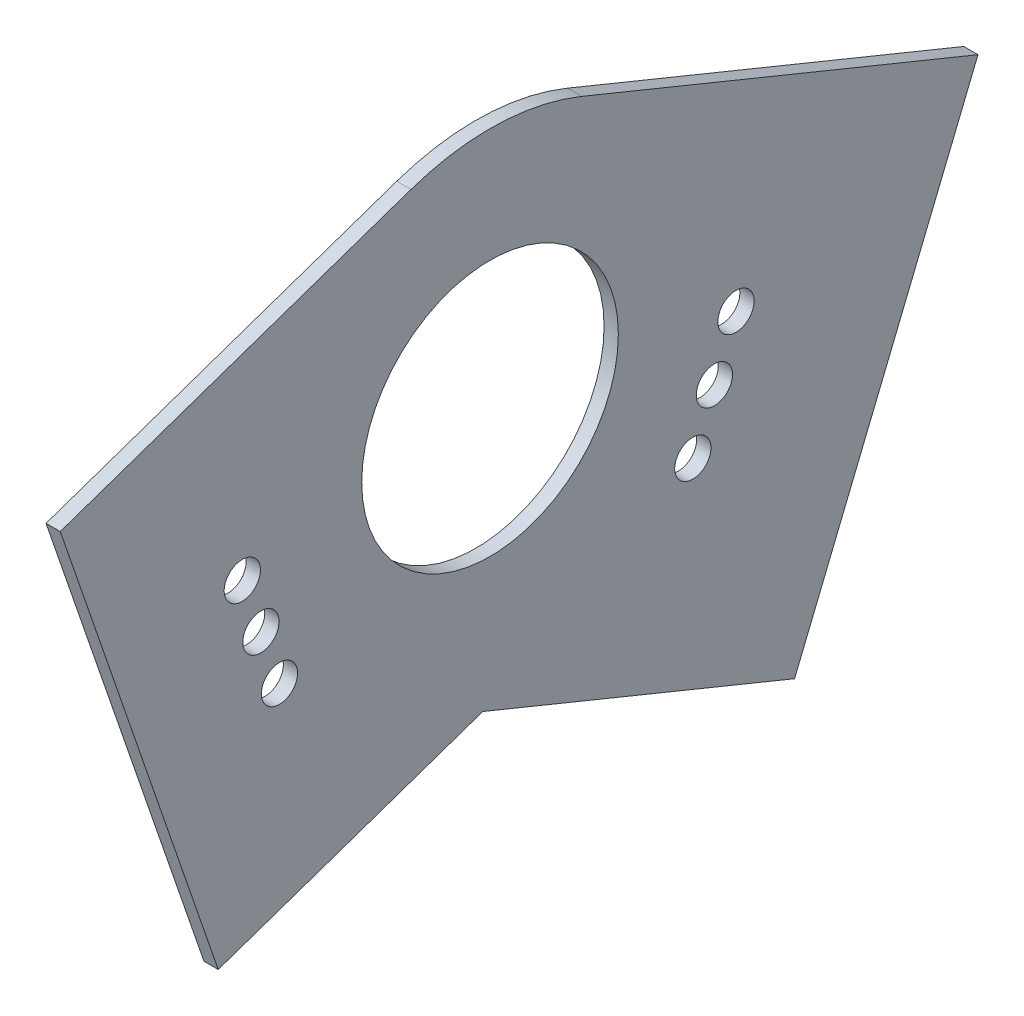
ISO-10303-21;
HEADER;
FILE_DESCRIPTION(('STEP AP214'),'2;1');
FILE_NAME('part.step','',(''),(''),'','','');
FILE_SCHEMA(('AUTOMOTIVE_DESIGN { 1 0 10303 214 1 1 1 1 }'));
ENDSEC;
DATA;
#1=APPLICATION_CONTEXT('core data for automotive mechanical design processes');
#2=APPLICATION_PROTOCOL_DEFINITION('international standard','automotive_design',2000,#1);
#3=PRODUCT_CONTEXT('',#1,'mechanical');
#4=PRODUCT('Part','Part','',(#3));
#5=PRODUCT_RELATED_PRODUCT_CATEGORY('part','',(#4));
#6=PRODUCT_DEFINITION_FORMATION('','',#4);
#7=PRODUCT_DEFINITION_CONTEXT('part definition',#1,'design');
#8=PRODUCT_DEFINITION('design','',#6,#7);
#9=PRODUCT_DEFINITION_SHAPE('','',#8);
#10=(LENGTH_UNIT() NAMED_UNIT(*) SI_UNIT(.MILLI.,.METRE.));
#11=(NAMED_UNIT(*) PLANE_ANGLE_UNIT() SI_UNIT($,.RADIAN.));
#12=(NAMED_UNIT(*) SI_UNIT($,.STERADIAN.) SOLID_ANGLE_UNIT());
#13=UNCERTAINTY_MEASURE_WITH_UNIT(LENGTH_MEASURE(1.E-05),#10,'distance_accuracy_value','');
#14=(GEOMETRIC_REPRESENTATION_CONTEXT(3) GLOBAL_UNCERTAINTY_ASSIGNED_CONTEXT((#13)) GLOBAL_UNIT_ASSIGNED_CONTEXT((#10,
#11,#12)) REPRESENTATION_CONTEXT('',''));
#15=CARTESIAN_POINT('',(0.,0.,0.));
#16=DIRECTION('',(0.,0.,1.));
#17=DIRECTION('',(1.,0.,0.));
#18=AXIS2_PLACEMENT_3D('',#15,#16,#17);
#19=CARTESIAN_POINT('',(0.,146.920050900126,-249.345231223034));
#20=DIRECTION('',(0.,-0.32589472207946,0.945406066259759));
#21=DIRECTION('',(0.,-0.945406066259759,-0.32589472207946));
#22=AXIS2_PLACEMENT_3D('',#19,#20,#21);
#23=PLANE('',#22);
#24=DIRECTION('',(1.,0.,0.));
#25=VECTOR('',#24,1.);
#26=CARTESIAN_POINT('',(0.,146.920050900126,-249.345231223034));
#27=LINE('',#26,#25);
#28=CARTESIAN_POINT('',(-1.5875,146.920050900126,-249.345231223034));
#29=VERTEX_POINT('',#28);
#30=CARTESIAN_POINT('',(0.,146.920050900126,-249.345231223034));
#31=VERTEX_POINT('',#30);
#32=EDGE_CURVE('E11',#29,#31,#27,.T.);
#33=ORIENTED_EDGE('',*,*,#32,.F.);
#34=DIRECTION('',(0.,-0.945406066259759,-0.32589472207946));
#35=VECTOR('',#34,1.);
#36=CARTESIAN_POINT('',(-1.5875,146.920050900126,-249.345231223034));
#37=LINE('',#36,#35);
#38=CARTESIAN_POINT('',(-1.5875,95.8917584737553,-266.935398847272));
#39=VERTEX_POINT('',#38);
#40=EDGE_CURVE('E100',#29,#39,#37,.T.);
#41=ORIENTED_EDGE('',*,*,#40,.T.);
#42=DIRECTION('',(1.,0.,0.));
#43=VECTOR('',#42,1.);
#44=CARTESIAN_POINT('',(0.,95.8917584737553,-266.935398847272));
#45=LINE('',#44,#43);
#46=CARTESIAN_POINT('',(0.,95.8917584737553,-266.935398847272));
#47=VERTEX_POINT('',#46);
#48=EDGE_CURVE('E46',#39,#47,#45,.T.);
#49=ORIENTED_EDGE('',*,*,#48,.T.);
#50=DIRECTION('',(0.,-0.945406066259759,-0.32589472207946));
#51=VECTOR('',#50,1.);
#52=CARTESIAN_POINT('',(0.,146.920050900126,-249.345231223034));
#53=LINE('',#52,#51);
#54=EDGE_CURVE('E136',#31,#47,#53,.T.);
#55=ORIENTED_EDGE('',*,*,#54,.F.);
#56=EDGE_LOOP('',(#33,#41,#49,#55));
#57=FACE_BOUND('',#56,.T.);
#58=ADVANCED_FACE('F36',(#57),#23,.T.);
#59=CARTESIAN_POINT('',(0.,95.8917584737553,-266.935398847272));
#60=DIRECTION('',(0.,-0.945406066259759,-0.32589472207946));
#61=DIRECTION('',(0.,0.32589472207946,-0.945406066259759));
#62=AXIS2_PLACEMENT_3D('',#59,#60,#61);
#63=PLANE('',#62);
#64=ORIENTED_EDGE('',*,*,#48,.F.);
#65=DIRECTION('',(0.,0.32589472207946,-0.945406066259759));
#66=VECTOR('',#65,1.);
#67=CARTESIAN_POINT('',(-1.5875,95.8917584737553,-266.935398847272));
#68=LINE('',#67,#66);
#69=CARTESIAN_POINT('',(-1.5875,106.044156633204,-296.387053497535));
#70=VERTEX_POINT('',#69);
#71=EDGE_CURVE('E119',#39,#70,#68,.T.);
#72=ORIENTED_EDGE('',*,*,#71,.T.);
#73=DIRECTION('',(1.,0.,0.));
#74=VECTOR('',#73,1.);
#75=CARTESIAN_POINT('',(0.,106.044156633204,-296.387053497535));
#76=LINE('',#75,#74);
#77=CARTESIAN_POINT('',(0.,106.044156633204,-296.387053497535));
#78=VERTEX_POINT('',#77);
#79=EDGE_CURVE('E129',#70,#78,#76,.T.);
#80=ORIENTED_EDGE('',*,*,#79,.T.);
#81=DIRECTION('',(0.,0.32589472207946,-0.945406066259759));
#82=VECTOR('',#81,1.);
#83=CARTESIAN_POINT('',(0.,95.8917584737553,-266.935398847272));
#84=LINE('',#83,#82);
#85=EDGE_CURVE('E145',#47,#78,#84,.T.);
#86=ORIENTED_EDGE('',*,*,#85,.F.);
#87=EDGE_LOOP('',(#64,#72,#80,#86));
#88=FACE_BOUND('',#87,.T.);
#89=ADVANCED_FACE('F148',(#88),#63,.T.);
#90=CARTESIAN_POINT('',(0.,106.044156633204,-296.387053497535));
#91=DIRECTION('',(0.,-0.925620560152266,0.378452875036518));
#92=DIRECTION('',(0.,-0.378452875036518,-0.925620560152266));
#93=AXIS2_PLACEMENT_3D('',#90,#91,#92);
#94=PLANE('',#93);
#95=ORIENTED_EDGE('',*,*,#79,.F.);
#96=DIRECTION('',(0.,-0.378452875036518,-0.925620560152266));
#97=VECTOR('',#96,1.);
#98=CARTESIAN_POINT('',(-1.5875,106.044156633204,-296.387053497535));
#99=LINE('',#98,#97);
#100=CARTESIAN_POINT('',(-1.5875,91.8512708518325,-331.1000329824));
#101=VERTEX_POINT('',#100);
#102=EDGE_CURVE('E116',#70,#101,#99,.T.);
#103=ORIENTED_EDGE('',*,*,#102,.T.);
#104=DIRECTION('',(1.,0.,0.));
#105=VECTOR('',#104,1.);
#106=CARTESIAN_POINT('',(0.,91.8512708518325,-331.1000329824));
#107=LINE('',#106,#105);
#108=CARTESIAN_POINT('',(0.,91.8512708518325,-331.1000329824));
#109=VERTEX_POINT('',#108);
#110=EDGE_CURVE('E126',#101,#109,#107,.T.);
#111=ORIENTED_EDGE('',*,*,#110,.T.);
#112=DIRECTION('',(0.,-0.378452875036518,-0.925620560152266));
#113=VECTOR('',#112,1.);
#114=CARTESIAN_POINT('',(0.,106.044156633204,-296.387053497535));
#115=LINE('',#114,#113);
#116=EDGE_CURVE('E149',#78,#109,#115,.T.);
#117=ORIENTED_EDGE('',*,*,#116,.F.);
#118=EDGE_LOOP('',(#95,#103,#111,#117));
#119=FACE_BOUND('',#118,.T.);
#120=ADVANCED_FACE('F198',(#119),#94,.T.);
#121=CARTESIAN_POINT('',(0.,91.8512708518325,-331.1000329824));
#122=DIRECTION('',(0.,-0.378452875036517,-0.925620560152266));
#123=DIRECTION('',(0.,0.925620560152266,-0.378452875036517));
#124=AXIS2_PLACEMENT_3D('',#121,#122,#123);
#125=PLANE('',#124);
#126=ORIENTED_EDGE('',*,*,#110,.F.);
#127=DIRECTION('',(0.,0.925620560152266,-0.378452875036517));
#128=VECTOR('',#127,1.);
#129=CARTESIAN_POINT('',(-1.5875,91.8512708518325,-331.1000329824));
#130=LINE('',#129,#128);
#131=CARTESIAN_POINT('',(-1.5875,141.811640586051,-351.527026912496));
#132=VERTEX_POINT('',#131);
#133=EDGE_CURVE('E113',#101,#132,#130,.T.);
#134=ORIENTED_EDGE('',*,*,#133,.T.);
#135=DIRECTION('',(1.,0.,0.));
#136=VECTOR('',#135,1.);
#137=CARTESIAN_POINT('',(0.,141.811640586051,-351.527026912496));
#138=LINE('',#137,#136);
#139=CARTESIAN_POINT('',(0.,141.811640586051,-351.527026912496));
#140=VERTEX_POINT('',#139);
#141=EDGE_CURVE('E124',#132,#140,#138,.T.);
#142=ORIENTED_EDGE('',*,*,#141,.T.);
#143=DIRECTION('',(0.,0.925620560152266,-0.378452875036517));
#144=VECTOR('',#143,1.);
#145=CARTESIAN_POINT('',(0.,91.8512708518325,-331.1000329824));
#146=LINE('',#145,#144);
#147=EDGE_CURVE('E151',#109,#140,#146,.T.);
#148=ORIENTED_EDGE('',*,*,#147,.F.);
#149=EDGE_LOOP('',(#126,#134,#142,#148));
#150=FACE_BOUND('',#149,.T.);
#151=ADVANCED_FACE('F203',(#150),#125,.T.);
#152=CARTESIAN_POINT('',(0.,141.811640586051,-351.527026912496));
#153=DIRECTION('',(0.,0.925620560152265,-0.378452875036518));
#154=DIRECTION('',(0.,0.378452875036518,0.925620560152265));
#155=AXIS2_PLACEMENT_3D('',#152,#153,#154);
#156=PLANE('',#155);
#157=ORIENTED_EDGE('',*,*,#141,.F.);
#158=DIRECTION('',(0.,0.378452875036518,0.925620560152265));
#159=VECTOR('',#158,1.);
#160=CARTESIAN_POINT('',(-1.5875,141.811640586051,-351.527026912496));
#161=LINE('',#160,#159);
#162=CARTESIAN_POINT('',(-1.5875,159.849395245253,-307.410261859704));
#163=VERTEX_POINT('',#162);
#164=EDGE_CURVE('E110',#132,#163,#161,.T.);
#165=ORIENTED_EDGE('',*,*,#164,.T.);
#166=DIRECTION('',(1.,0.,0.));
#167=VECTOR('',#166,1.);
#168=CARTESIAN_POINT('',(0.,159.849395245253,-307.410261859704));
#169=LINE('',#168,#167);
#170=CARTESIAN_POINT('',(0.,159.849395245253,-307.410261859704));
#171=VERTEX_POINT('',#170);
#172=EDGE_CURVE('E54',#163,#171,#169,.T.);
#173=ORIENTED_EDGE('',*,*,#172,.T.);
#174=DIRECTION('',(0.,0.378452875036518,0.925620560152265));
#175=VECTOR('',#174,1.);
#176=CARTESIAN_POINT('',(0.,141.811640586051,-351.527026912496));
#177=LINE('',#176,#175);
#178=EDGE_CURVE('E93',#140,#171,#177,.T.);
#179=ORIENTED_EDGE('',*,*,#178,.F.);
#180=EDGE_LOOP('',(#157,#165,#173,#179));
#181=FACE_BOUND('',#180,.T.);
#182=ADVANCED_FACE('F207',(#181),#156,.T.);
#183=CARTESIAN_POINT('',(0.,134.869210378144,-297.196764894656));
#184=DIRECTION('',(1.,0.,0.));
#185=DIRECTION('',(0.,0.,-1.));
#186=AXIS2_PLACEMENT_3D('',#183,#184,#185);
#187=CYLINDRICAL_SURFACE('',#186,26.9875);
#188=ORIENTED_EDGE('',*,*,#172,.F.);
#189=CARTESIAN_POINT('',(-1.5875,134.869210378144,-297.196764894656));
#190=DIRECTION('',(1.,0.,0.));
#191=DIRECTION('',(0.,0.,-1.));
#192=AXIS2_PLACEMENT_3D('',#189,#190,#191);
#193=CIRCLE('',#192,26.9875);
#194=CARTESIAN_POINT('',(-1.5875,160.383356591329,-288.401681082536));
#195=VERTEX_POINT('',#194);
#196=EDGE_CURVE('E98',#163,#195,#193,.T.);
#197=ORIENTED_EDGE('',*,*,#196,.T.);
#198=DIRECTION('',(1.,0.,0.));
#199=VECTOR('',#198,1.);
#200=CARTESIAN_POINT('',(0.,160.383356591329,-288.401681082536));
#201=LINE('',#200,#199);
#202=CARTESIAN_POINT('',(0.,160.383356591329,-288.401681082536));
#203=VERTEX_POINT('',#202);
#204=EDGE_CURVE('E40',#195,#203,#201,.T.);
#205=ORIENTED_EDGE('',*,*,#204,.T.);
#206=CARTESIAN_POINT('',(0.,134.869210378144,-297.196764894656));
#207=DIRECTION('',(1.,0.,0.));
#208=DIRECTION('',(0.,0.,-1.));
#209=AXIS2_PLACEMENT_3D('',#206,#207,#208);
#210=CIRCLE('',#209,26.9875);
#211=EDGE_CURVE('E283',#171,#203,#210,.T.);
#212=ORIENTED_EDGE('',*,*,#211,.F.);
#213=EDGE_LOOP('',(#188,#197,#205,#212));
#214=FACE_BOUND('',#213,.T.);
#215=ADVANCED_FACE('F102',(#214),#187,.T.);
#216=CARTESIAN_POINT('',(0.,118.778022856129,-319.773774005283));
#217=DIRECTION('',(1.,0.,0.));
#218=DIRECTION('',(0.,0.,-1.));
#219=AXIS2_PLACEMENT_3D('',#216,#217,#218);
#220=CYLINDRICAL_SURFACE('',#219,2.01929999999998);
#221=CARTESIAN_POINT('',(0.,118.778022856129,-319.773774005283));
#222=DIRECTION('',(1.,0.,0.));
#223=DIRECTION('',(0.,0.,-1.));
#224=AXIS2_PLACEMENT_3D('',#221,#222,#223);
#225=CIRCLE('',#224,2.01929999999998);
#226=CARTESIAN_POINT('',(0.,118.778022856129,-321.793074005283));
#227=VERTEX_POINT('',#226);
#228=EDGE_CURVE('E112',#227,#227,#225,.T.);
#229=ORIENTED_EDGE('',*,*,#228,.T.);
#230=EDGE_LOOP('',(#229));
#231=FACE_BOUND('',#230,.T.);
#232=CARTESIAN_POINT('',(-1.5875,118.778022856129,-319.773774005283));
#233=DIRECTION('',(1.,0.,0.));
#234=DIRECTION('',(0.,0.,-1.));
#235=AXIS2_PLACEMENT_3D('',#232,#233,#234);
#236=CIRCLE('',#235,2.01929999999998);
#237=CARTESIAN_POINT('',(-1.5875,118.778022856129,-321.793074005283));
#238=VERTEX_POINT('',#237);
#239=EDGE_CURVE('E159',#238,#238,#236,.T.);
#240=ORIENTED_EDGE('',*,*,#239,.F.);
#241=EDGE_LOOP('',(#240));
#242=FACE_BOUND('',#241,.T.);
#243=ADVANCED_FACE('F212',(#231,#242),#220,.F.);
#244=CARTESIAN_POINT('',(0.,124.655713413096,-322.176949761765));
#245=DIRECTION('',(1.,0.,0.));
#246=DIRECTION('',(0.,0.,-1.));
#247=AXIS2_PLACEMENT_3D('',#244,#245,#246);
#248=CYLINDRICAL_SURFACE('',#247,2.01929999999998);
#249=CARTESIAN_POINT('',(0.,124.655713413096,-322.176949761765));
#250=DIRECTION('',(1.,0.,0.));
#251=DIRECTION('',(0.,0.,-1.));
#252=AXIS2_PLACEMENT_3D('',#249,#250,#251);
#253=CIRCLE('',#252,2.01929999999998);
#254=CARTESIAN_POINT('',(0.,124.655713413096,-324.196249761765));
#255=VERTEX_POINT('',#254);
#256=EDGE_CURVE('E267',#255,#255,#253,.T.);
#257=ORIENTED_EDGE('',*,*,#256,.T.);
#258=EDGE_LOOP('',(#257));
#259=FACE_BOUND('',#258,.T.);
#260=CARTESIAN_POINT('',(-1.5875,124.655713413096,-322.176949761765));
#261=DIRECTION('',(1.,0.,0.));
#262=DIRECTION('',(0.,0.,-1.));
#263=AXIS2_PLACEMENT_3D('',#260,#261,#262);
#264=CIRCLE('',#263,2.01929999999998);
#265=CARTESIAN_POINT('',(-1.5875,124.655713413096,-324.196249761765));
#266=VERTEX_POINT('',#265);
#267=EDGE_CURVE('E162',#266,#266,#264,.T.);
#268=ORIENTED_EDGE('',*,*,#267,.F.);
#269=EDGE_LOOP('',(#268));
#270=FACE_BOUND('',#269,.T.);
#271=ADVANCED_FACE('F216',(#259,#270),#248,.F.);
#272=CARTESIAN_POINT('',(0.,130.533403970062,-324.580125518247));
#273=DIRECTION('',(1.,0.,0.));
#274=DIRECTION('',(0.,0.,-1.));
#275=AXIS2_PLACEMENT_3D('',#272,#273,#274);
#276=CYLINDRICAL_SURFACE('',#275,2.01929999999998);
#277=CARTESIAN_POINT('',(0.,130.533403970062,-324.580125518247));
#278=DIRECTION('',(1.,0.,0.));
#279=DIRECTION('',(0.,0.,-1.));
#280=AXIS2_PLACEMENT_3D('',#277,#278,#279);
#281=CIRCLE('',#280,2.01929999999998);
#282=CARTESIAN_POINT('',(0.,130.533403970062,-326.599425518247));
#283=VERTEX_POINT('',#282);
#284=EDGE_CURVE('E271',#283,#283,#281,.T.);
#285=ORIENTED_EDGE('',*,*,#284,.T.);
#286=EDGE_LOOP('',(#285));
#287=FACE_BOUND('',#286,.T.);
#288=CARTESIAN_POINT('',(-1.5875,130.533403970062,-324.580125518247));
#289=DIRECTION('',(1.,0.,0.));
#290=DIRECTION('',(0.,0.,-1.));
#291=AXIS2_PLACEMENT_3D('',#288,#289,#290);
#292=CIRCLE('',#291,2.01929999999998);
#293=CARTESIAN_POINT('',(-1.5875,130.533403970062,-326.599425518247));
#294=VERTEX_POINT('',#293);
#295=EDGE_CURVE('E165',#294,#294,#292,.T.);
#296=ORIENTED_EDGE('',*,*,#295,.F.);
#297=EDGE_LOOP('',(#296));
#298=FACE_BOUND('',#297,.T.);
#299=ADVANCED_FACE('F222',(#287,#298),#276,.F.);
#300=CARTESIAN_POINT('',(0.,134.869210378144,-297.196764894656));
#301=DIRECTION('',(1.,0.,0.));
#302=DIRECTION('',(0.,0.,-1.));
#303=AXIS2_PLACEMENT_3D('',#300,#301,#302);
#304=CYLINDRICAL_SURFACE('',#303,14.2875);
#305=CARTESIAN_POINT('',(0.,134.869210378144,-297.196764894656));
#306=DIRECTION('',(1.,0.,0.));
#307=DIRECTION('',(0.,0.,-1.));
#308=AXIS2_PLACEMENT_3D('',#305,#306,#307);
#309=CIRCLE('',#308,14.2875);
#310=CARTESIAN_POINT('',(0.,134.869210378144,-311.484264894656));
#311=VERTEX_POINT('',#310);
#312=EDGE_CURVE('E240',#311,#311,#309,.T.);
#313=ORIENTED_EDGE('',*,*,#312,.T.);
#314=EDGE_LOOP('',(#313));
#315=FACE_BOUND('',#314,.T.);
#316=CARTESIAN_POINT('',(-1.5875,134.869210378144,-297.196764894656));
#317=DIRECTION('',(1.,0.,0.));
#318=DIRECTION('',(0.,0.,-1.));
#319=AXIS2_PLACEMENT_3D('',#316,#317,#318);
#320=CIRCLE('',#319,14.2875);
#321=CARTESIAN_POINT('',(-1.5875,134.869210378144,-311.484264894656));
#322=VERTEX_POINT('',#321);
#323=EDGE_CURVE('E168',#322,#322,#320,.T.);
#324=ORIENTED_EDGE('',*,*,#323,.F.);
#325=EDGE_LOOP('',(#324));
#326=FACE_BOUND('',#325,.T.);
#327=ADVANCED_FACE('F190',(#315,#326),#304,.F.);
#328=CARTESIAN_POINT('',(0.,120.070798045275,-273.752050166675));
#329=DIRECTION('',(1.,0.,0.));
#330=DIRECTION('',(0.,0.,-1.));
#331=AXIS2_PLACEMENT_3D('',#328,#329,#330);
#332=CYLINDRICAL_SURFACE('',#331,2.01929999999992);
#333=CARTESIAN_POINT('',(0.,120.070798045275,-273.752050166675));
#334=DIRECTION('',(1.,0.,0.));
#335=DIRECTION('',(0.,0.,-1.));
#336=AXIS2_PLACEMENT_3D('',#333,#334,#335);
#337=CIRCLE('',#336,2.01929999999992);
#338=CARTESIAN_POINT('',(0.,120.070798045275,-275.771350166675));
#339=VERTEX_POINT('',#338);
#340=EDGE_CURVE('E276',#339,#339,#337,.T.);
#341=ORIENTED_EDGE('',*,*,#340,.T.);
#342=EDGE_LOOP('',(#341));
#343=FACE_BOUND('',#342,.T.);
#344=CARTESIAN_POINT('',(-1.5875,120.070798045275,-273.752050166675));
#345=DIRECTION('',(1.,0.,0.));
#346=DIRECTION('',(0.,0.,-1.));
#347=AXIS2_PLACEMENT_3D('',#344,#345,#346);
#348=CIRCLE('',#347,2.01929999999992);
#349=CARTESIAN_POINT('',(-1.5875,120.070798045275,-275.771350166675));
#350=VERTEX_POINT('',#349);
#351=EDGE_CURVE('E171',#350,#350,#348,.T.);
#352=ORIENTED_EDGE('',*,*,#351,.F.);
#353=EDGE_LOOP('',(#352));
#354=FACE_BOUND('',#353,.T.);
#355=ADVANCED_FACE('F181',(#343,#354),#332,.F.);
#356=CARTESIAN_POINT('',(0.,126.074126566024,-271.682618681471));
#357=DIRECTION('',(1.,0.,0.));
#358=DIRECTION('',(0.,0.,-1.));
#359=AXIS2_PLACEMENT_3D('',#356,#357,#358);
#360=CYLINDRICAL_SURFACE('',#359,2.01929999999998);
#361=CARTESIAN_POINT('',(0.,126.074126566024,-271.682618681471));
#362=DIRECTION('',(1.,0.,0.));
#363=DIRECTION('',(0.,0.,-1.));
#364=AXIS2_PLACEMENT_3D('',#361,#362,#363);
#365=CIRCLE('',#364,2.01929999999998);
#366=CARTESIAN_POINT('',(0.,126.074126566024,-273.70191868147));
#367=VERTEX_POINT('',#366);
#368=EDGE_CURVE('E279',#367,#367,#365,.T.);
#369=ORIENTED_EDGE('',*,*,#368,.T.);
#370=EDGE_LOOP('',(#369));
#371=FACE_BOUND('',#370,.T.);
#372=CARTESIAN_POINT('',(-1.5875,126.074126566024,-271.682618681471));
#373=DIRECTION('',(1.,0.,0.));
#374=DIRECTION('',(0.,0.,-1.));
#375=AXIS2_PLACEMENT_3D('',#372,#373,#374);
#376=CIRCLE('',#375,2.01929999999998);
#377=CARTESIAN_POINT('',(-1.5875,126.074126566024,-273.70191868147));
#378=VERTEX_POINT('',#377);
#379=EDGE_CURVE('E106',#378,#378,#376,.T.);
#380=ORIENTED_EDGE('',*,*,#379,.F.);
#381=EDGE_LOOP('',(#380));
#382=FACE_BOUND('',#381,.T.);
#383=ADVANCED_FACE('F178',(#371,#382),#360,.F.);
#384=CARTESIAN_POINT('',(0.,132.077455086774,-269.613187196266));
#385=DIRECTION('',(1.,0.,0.));
#386=DIRECTION('',(0.,0.,-1.));
#387=AXIS2_PLACEMENT_3D('',#384,#385,#386);
#388=CYLINDRICAL_SURFACE('',#387,2.01929999999998);
#389=CARTESIAN_POINT('',(0.,132.077455086774,-269.613187196266));
#390=DIRECTION('',(1.,0.,0.));
#391=DIRECTION('',(0.,0.,-1.));
#392=AXIS2_PLACEMENT_3D('',#389,#390,#391);
#393=CIRCLE('',#392,2.01929999999998);
#394=CARTESIAN_POINT('',(0.,132.077455086774,-271.632487196266));
#395=VERTEX_POINT('',#394);
#396=EDGE_CURVE('E282',#395,#395,#393,.T.);
#397=ORIENTED_EDGE('',*,*,#396,.T.);
#398=EDGE_LOOP('',(#397));
#399=FACE_BOUND('',#398,.T.);
#400=CARTESIAN_POINT('',(-1.5875,132.077455086774,-269.613187196266));
#401=DIRECTION('',(1.,0.,0.));
#402=DIRECTION('',(0.,0.,-1.));
#403=AXIS2_PLACEMENT_3D('',#400,#401,#402);
#404=CIRCLE('',#403,2.01929999999998);
#405=CARTESIAN_POINT('',(-1.5875,132.077455086774,-271.632487196266));
#406=VERTEX_POINT('',#405);
#407=EDGE_CURVE('E103',#406,#406,#404,.T.);
#408=ORIENTED_EDGE('',*,*,#407,.F.);
#409=EDGE_LOOP('',(#408));
#410=FACE_BOUND('',#409,.T.);
#411=ADVANCED_FACE('F180',(#399,#410),#388,.F.);
#412=CARTESIAN_POINT('',(0.,160.383356591329,-288.401681082536));
#413=DIRECTION('',(0.,0.945406066259759,0.325894722079459));
#414=DIRECTION('',(0.,-0.325894722079459,0.945406066259759));
#415=AXIS2_PLACEMENT_3D('',#412,#413,#414);
#416=PLANE('',#415);
#417=DIRECTION('',(0.,-0.325894722079459,0.945406066259759));
#418=VECTOR('',#417,1.);
#419=CARTESIAN_POINT('',(-1.5875,160.383356591329,-288.401681082536));
#420=LINE('',#419,#418);
#421=EDGE_CURVE('E87',#195,#29,#420,.T.);
#422=ORIENTED_EDGE('',*,*,#421,.T.);
#423=ORIENTED_EDGE('',*,*,#32,.T.);
#424=DIRECTION('',(0.,-0.325894722079459,0.945406066259759));
#425=VECTOR('',#424,1.);
#426=CARTESIAN_POINT('',(0.,160.383356591329,-288.401681082536));
#427=LINE('',#426,#425);
#428=EDGE_CURVE('E89',#203,#31,#427,.T.);
#429=ORIENTED_EDGE('',*,*,#428,.F.);
#430=ORIENTED_EDGE('',*,*,#204,.F.);
#431=EDGE_LOOP('',(#422,#423,#429,#430));
#432=FACE_BOUND('',#431,.T.);
#433=ADVANCED_FACE('F38',(#432),#416,.T.);
#434=CARTESIAN_POINT('',(0.,134.869210378144,-297.196764894656));
#435=DIRECTION('',(1.,0.,0.));
#436=DIRECTION('',(0.,0.,-1.));
#437=AXIS2_PLACEMENT_3D('',#434,#435,#436);
#438=PLANE('',#437);
#439=ORIENTED_EDGE('',*,*,#228,.F.);
#440=EDGE_LOOP('',(#439));
#441=FACE_BOUND('',#440,.T.);
#442=ORIENTED_EDGE('',*,*,#256,.F.);
#443=EDGE_LOOP('',(#442));
#444=FACE_BOUND('',#443,.T.);
#445=ORIENTED_EDGE('',*,*,#284,.F.);
#446=EDGE_LOOP('',(#445));
#447=FACE_BOUND('',#446,.T.);
#448=ORIENTED_EDGE('',*,*,#312,.F.);
#449=EDGE_LOOP('',(#448));
#450=FACE_BOUND('',#449,.T.);
#451=ORIENTED_EDGE('',*,*,#340,.F.);
#452=EDGE_LOOP('',(#451));
#453=FACE_BOUND('',#452,.T.);
#454=ORIENTED_EDGE('',*,*,#368,.F.);
#455=EDGE_LOOP('',(#454));
#456=FACE_BOUND('',#455,.T.);
#457=ORIENTED_EDGE('',*,*,#396,.F.);
#458=EDGE_LOOP('',(#457));
#459=FACE_BOUND('',#458,.T.);
#460=ORIENTED_EDGE('',*,*,#211,.T.);
#461=ORIENTED_EDGE('',*,*,#428,.T.);
#462=ORIENTED_EDGE('',*,*,#54,.T.);
#463=ORIENTED_EDGE('',*,*,#85,.T.);
#464=ORIENTED_EDGE('',*,*,#116,.T.);
#465=ORIENTED_EDGE('',*,*,#147,.T.);
#466=ORIENTED_EDGE('',*,*,#178,.T.);
#467=EDGE_LOOP('',(#460,#461,#462,#463,#464,#465,#466));
#468=FACE_BOUND('',#467,.T.);
#469=ADVANCED_FACE('F143',(#441,#444,#447,#450,#453,#456,#459,#468),#438,.T.);
#470=CARTESIAN_POINT('',(-1.5875,134.869210378144,-297.196764894656));
#471=DIRECTION('',(1.,0.,0.));
#472=DIRECTION('',(0.,0.,-1.));
#473=AXIS2_PLACEMENT_3D('',#470,#471,#472);
#474=PLANE('',#473);
#475=ORIENTED_EDGE('',*,*,#239,.T.);
#476=EDGE_LOOP('',(#475));
#477=FACE_BOUND('',#476,.T.);
#478=ORIENTED_EDGE('',*,*,#267,.T.);
#479=EDGE_LOOP('',(#478));
#480=FACE_BOUND('',#479,.T.);
#481=ORIENTED_EDGE('',*,*,#295,.T.);
#482=EDGE_LOOP('',(#481));
#483=FACE_BOUND('',#482,.T.);
#484=ORIENTED_EDGE('',*,*,#323,.T.);
#485=EDGE_LOOP('',(#484));
#486=FACE_BOUND('',#485,.T.);
#487=ORIENTED_EDGE('',*,*,#351,.T.);
#488=EDGE_LOOP('',(#487));
#489=FACE_BOUND('',#488,.T.);
#490=ORIENTED_EDGE('',*,*,#379,.T.);
#491=EDGE_LOOP('',(#490));
#492=FACE_BOUND('',#491,.T.);
#493=ORIENTED_EDGE('',*,*,#407,.T.);
#494=EDGE_LOOP('',(#493));
#495=FACE_BOUND('',#494,.T.);
#496=ORIENTED_EDGE('',*,*,#196,.F.);
#497=ORIENTED_EDGE('',*,*,#164,.F.);
#498=ORIENTED_EDGE('',*,*,#133,.F.);
#499=ORIENTED_EDGE('',*,*,#102,.F.);
#500=ORIENTED_EDGE('',*,*,#71,.F.);
#501=ORIENTED_EDGE('',*,*,#40,.F.);
#502=ORIENTED_EDGE('',*,*,#421,.F.);
#503=EDGE_LOOP('',(#496,#497,#498,#499,#500,#501,#502));
#504=FACE_BOUND('',#503,.T.);
#505=ADVANCED_FACE('F96',(#477,#480,#483,#486,#489,#492,#495,#504),#474,.F.);
#506=CLOSED_SHELL('',(#58,#89,#120,#151,#182,#215,#243,#271,#299,#327,#355,#383,#411,#433,#469,#505));
#507=MANIFOLD_SOLID_BREP('B2',#506);
#508=ADVANCED_BREP_SHAPE_REPRESENTATION('',(#18,#507),#14);
#509=SHAPE_DEFINITION_REPRESENTATION(#9,#508);
ENDSEC;
END-ISO-10303-21;
